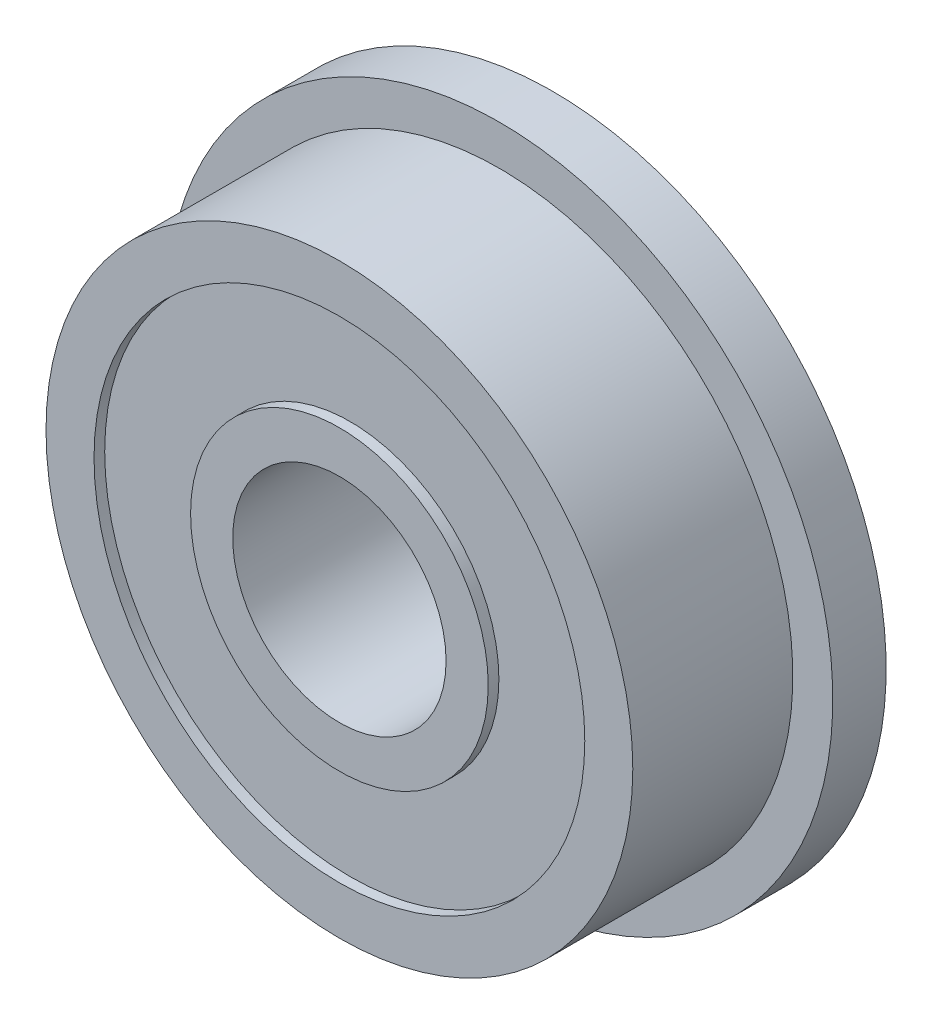
ISO-10303-21;
HEADER;
FILE_DESCRIPTION(('STEP AP214'),'2;1');
FILE_NAME('part.step','',(''),(''),'','','');
FILE_SCHEMA(('AUTOMOTIVE_DESIGN { 1 0 10303 214 1 1 1 1 }'));
ENDSEC;
DATA;
#1=APPLICATION_CONTEXT('core data for automotive mechanical design processes');
#2=APPLICATION_PROTOCOL_DEFINITION('international standard','automotive_design',2000,#1);
#3=PRODUCT_CONTEXT('',#1,'mechanical');
#4=PRODUCT('Part','Part','',(#3));
#5=PRODUCT_RELATED_PRODUCT_CATEGORY('part','',(#4));
#6=PRODUCT_DEFINITION_FORMATION('','',#4);
#7=PRODUCT_DEFINITION_CONTEXT('part definition',#1,'design');
#8=PRODUCT_DEFINITION('design','',#6,#7);
#9=PRODUCT_DEFINITION_SHAPE('','',#8);
#10=(LENGTH_UNIT() NAMED_UNIT(*) SI_UNIT(.MILLI.,.METRE.));
#11=(NAMED_UNIT(*) PLANE_ANGLE_UNIT() SI_UNIT($,.RADIAN.));
#12=(NAMED_UNIT(*) SI_UNIT($,.STERADIAN.) SOLID_ANGLE_UNIT());
#13=UNCERTAINTY_MEASURE_WITH_UNIT(LENGTH_MEASURE(1.E-05),#10,'distance_accuracy_value','');
#14=(GEOMETRIC_REPRESENTATION_CONTEXT(3) GLOBAL_UNCERTAINTY_ASSIGNED_CONTEXT((#13)) GLOBAL_UNIT_ASSIGNED_CONTEXT((#10,
#11,#12)) REPRESENTATION_CONTEXT('',''));
#15=CARTESIAN_POINT('',(0.,0.,0.));
#16=DIRECTION('',(0.,0.,1.));
#17=DIRECTION('',(1.,0.,0.));
#18=AXIS2_PLACEMENT_3D('',#15,#16,#17);
#19=CARTESIAN_POINT('',(0.,0.,-2.));
#20=DIRECTION('',(0.,0.,1.));
#21=DIRECTION('',(1.,0.,0.));
#22=AXIS2_PLACEMENT_3D('',#19,#20,#21);
#23=PLANE('',#22);
#24=CARTESIAN_POINT('',(0.,0.,-2.));
#25=DIRECTION('',(0.,0.,1.));
#26=DIRECTION('',(1.,0.,0.));
#27=AXIS2_PLACEMENT_3D('',#24,#25,#26);
#28=CIRCLE('',#27,2.);
#29=CARTESIAN_POINT('',(2.,0.,-2.));
#30=VERTEX_POINT('',#29);
#31=EDGE_CURVE('E50',#30,#30,#28,.T.);
#32=ORIENTED_EDGE('',*,*,#31,.T.);
#33=EDGE_LOOP('',(#32));
#34=FACE_BOUND('',#33,.T.);
#35=CARTESIAN_POINT('',(0.,0.,-2.));
#36=DIRECTION('',(0.,0.,1.));
#37=DIRECTION('',(1.,0.,0.));
#38=AXIS2_PLACEMENT_3D('',#35,#36,#37);
#39=CIRCLE('',#38,2.79);
#40=CARTESIAN_POINT('',(2.79,0.,-2.));
#41=VERTEX_POINT('',#40);
#42=EDGE_CURVE('E76',#41,#41,#39,.T.);
#43=ORIENTED_EDGE('',*,*,#42,.F.);
#44=EDGE_LOOP('',(#43));
#45=FACE_BOUND('',#44,.T.);
#46=ADVANCED_FACE('F31',(#34,#45),#23,.F.);
#47=CARTESIAN_POINT('',(0.,0.,2.));
#48=DIRECTION('',(0.,0.,1.));
#49=DIRECTION('',(1.,0.,0.));
#50=AXIS2_PLACEMENT_3D('',#47,#48,#49);
#51=PLANE('',#50);
#52=CARTESIAN_POINT('',(0.,0.,2.));
#53=DIRECTION('',(0.,0.,1.));
#54=DIRECTION('',(1.,0.,0.));
#55=AXIS2_PLACEMENT_3D('',#52,#53,#54);
#56=CIRCLE('',#55,2.);
#57=CARTESIAN_POINT('',(2.,0.,2.));
#58=VERTEX_POINT('',#57);
#59=EDGE_CURVE('E52',#58,#58,#56,.T.);
#60=ORIENTED_EDGE('',*,*,#59,.F.);
#61=EDGE_LOOP('',(#60));
#62=FACE_BOUND('',#61,.T.);
#63=CARTESIAN_POINT('',(0.,0.,2.));
#64=DIRECTION('',(0.,0.,1.));
#65=DIRECTION('',(1.,0.,0.));
#66=AXIS2_PLACEMENT_3D('',#63,#64,#65);
#67=CIRCLE('',#66,2.79);
#68=CARTESIAN_POINT('',(2.79,0.,2.));
#69=VERTEX_POINT('',#68);
#70=EDGE_CURVE('E64',#69,#69,#67,.T.);
#71=ORIENTED_EDGE('',*,*,#70,.T.);
#72=EDGE_LOOP('',(#71));
#73=FACE_BOUND('',#72,.T.);
#74=ADVANCED_FACE('F92',(#62,#73),#51,.T.);
#75=CARTESIAN_POINT('',(0.,0.,2.));
#76=DIRECTION('',(0.,0.,-1.));
#77=DIRECTION('',(-1.,0.,0.));
#78=AXIS2_PLACEMENT_3D('',#75,#76,#77);
#79=CYLINDRICAL_SURFACE('',#78,5.5);
#80=CARTESIAN_POINT('',(0.,0.,2.));
#81=DIRECTION('',(0.,0.,1.));
#82=DIRECTION('',(1.,0.,0.));
#83=AXIS2_PLACEMENT_3D('',#80,#81,#82);
#84=CIRCLE('',#83,5.5);
#85=CARTESIAN_POINT('',(5.5,0.,2.));
#86=VERTEX_POINT('',#85);
#87=EDGE_CURVE('E38',#86,#86,#84,.T.);
#88=ORIENTED_EDGE('',*,*,#87,.F.);
#89=EDGE_LOOP('',(#88));
#90=FACE_BOUND('',#89,.T.);
#91=CARTESIAN_POINT('',(0.,0.,-1.));
#92=DIRECTION('',(0.,0.,-1.));
#93=DIRECTION('',(-1.,0.,0.));
#94=AXIS2_PLACEMENT_3D('',#91,#92,#93);
#95=CIRCLE('',#94,5.5);
#96=CARTESIAN_POINT('',(-5.5,0.,-1.));
#97=VERTEX_POINT('',#96);
#98=EDGE_CURVE('E10',#97,#97,#95,.T.);
#99=ORIENTED_EDGE('',*,*,#98,.F.);
#100=EDGE_LOOP('',(#99));
#101=FACE_BOUND('',#100,.T.);
#102=ADVANCED_FACE('F33',(#90,#101),#79,.T.);
#103=CARTESIAN_POINT('',(0.,0.,2.));
#104=DIRECTION('',(0.,0.,1.));
#105=DIRECTION('',(1.,0.,0.));
#106=AXIS2_PLACEMENT_3D('',#103,#104,#105);
#107=CIRCLE('',#106,4.6);
#108=CARTESIAN_POINT('',(4.6,0.,2.));
#109=VERTEX_POINT('',#108);
#110=EDGE_CURVE('E58',#109,#109,#107,.T.);
#111=ORIENTED_EDGE('',*,*,#110,.F.);
#112=EDGE_LOOP('',(#111));
#113=FACE_BOUND('',#112,.T.);
#114=ORIENTED_EDGE('',*,*,#87,.T.);
#115=EDGE_LOOP('',(#114));
#116=FACE_BOUND('',#115,.T.);
#117=ADVANCED_FACE('F100',(#113,#116),#51,.T.);
#118=CARTESIAN_POINT('',(0.,0.,-1.));
#119=DIRECTION('',(0.,0.,-1.));
#120=DIRECTION('',(-1.,0.,0.));
#121=AXIS2_PLACEMENT_3D('',#118,#119,#120);
#122=CYLINDRICAL_SURFACE('',#121,6.25);
#123=CARTESIAN_POINT('',(0.,0.,-1.));
#124=DIRECTION('',(0.,0.,-1.));
#125=DIRECTION('',(-1.,0.,0.));
#126=AXIS2_PLACEMENT_3D('',#123,#124,#125);
#127=CIRCLE('',#126,6.25);
#128=CARTESIAN_POINT('',(-6.25,0.,-1.));
#129=VERTEX_POINT('',#128);
#130=EDGE_CURVE('E42',#129,#129,#127,.T.);
#131=ORIENTED_EDGE('',*,*,#130,.T.);
#132=EDGE_LOOP('',(#131));
#133=FACE_BOUND('',#132,.T.);
#134=CARTESIAN_POINT('',(0.,0.,-2.));
#135=DIRECTION('',(0.,0.,-1.));
#136=DIRECTION('',(-1.,0.,0.));
#137=AXIS2_PLACEMENT_3D('',#134,#135,#136);
#138=CIRCLE('',#137,6.25);
#139=CARTESIAN_POINT('',(-6.25,0.,-2.));
#140=VERTEX_POINT('',#139);
#141=EDGE_CURVE('E46',#140,#140,#138,.T.);
#142=ORIENTED_EDGE('',*,*,#141,.F.);
#143=EDGE_LOOP('',(#142));
#144=FACE_BOUND('',#143,.T.);
#145=ADVANCED_FACE('F112',(#133,#144),#122,.T.);
#146=CARTESIAN_POINT('',(0.,0.,-1.));
#147=DIRECTION('',(0.,0.,-1.));
#148=DIRECTION('',(-1.,0.,0.));
#149=AXIS2_PLACEMENT_3D('',#146,#147,#148);
#150=PLANE('',#149);
#151=ORIENTED_EDGE('',*,*,#98,.T.);
#152=EDGE_LOOP('',(#151));
#153=FACE_BOUND('',#152,.T.);
#154=ORIENTED_EDGE('',*,*,#130,.F.);
#155=EDGE_LOOP('',(#154));
#156=FACE_BOUND('',#155,.T.);
#157=ADVANCED_FACE('F103',(#153,#156),#150,.F.);
#158=CARTESIAN_POINT('',(0.,0.,-2.));
#159=DIRECTION('',(0.,0.,1.));
#160=DIRECTION('',(1.,0.,0.));
#161=AXIS2_PLACEMENT_3D('',#158,#159,#160);
#162=CIRCLE('',#161,4.6);
#163=CARTESIAN_POINT('',(4.6,0.,-2.));
#164=VERTEX_POINT('',#163);
#165=EDGE_CURVE('E70',#164,#164,#162,.T.);
#166=ORIENTED_EDGE('',*,*,#165,.T.);
#167=EDGE_LOOP('',(#166));
#168=FACE_BOUND('',#167,.T.);
#169=ORIENTED_EDGE('',*,*,#141,.T.);
#170=EDGE_LOOP('',(#169));
#171=FACE_BOUND('',#170,.T.);
#172=ADVANCED_FACE('F94',(#168,#171),#23,.F.);
#173=CARTESIAN_POINT('',(0.,0.,-2.));
#174=DIRECTION('',(0.,0.,1.));
#175=DIRECTION('',(1.,0.,0.));
#176=AXIS2_PLACEMENT_3D('',#173,#174,#175);
#177=CYLINDRICAL_SURFACE('',#176,2.);
#178=ORIENTED_EDGE('',*,*,#31,.F.);
#179=EDGE_LOOP('',(#178));
#180=FACE_BOUND('',#179,.T.);
#181=ORIENTED_EDGE('',*,*,#59,.T.);
#182=EDGE_LOOP('',(#181));
#183=FACE_BOUND('',#182,.T.);
#184=ADVANCED_FACE('F102',(#180,#183),#177,.F.);
#185=CARTESIAN_POINT('',(0.,0.,1.8));
#186=DIRECTION('',(0.,0.,1.));
#187=DIRECTION('',(1.,0.,0.));
#188=AXIS2_PLACEMENT_3D('',#185,#186,#187);
#189=CYLINDRICAL_SURFACE('',#188,4.6);
#190=CARTESIAN_POINT('',(0.,0.,1.8));
#191=DIRECTION('',(0.,0.,1.));
#192=DIRECTION('',(1.,0.,0.));
#193=AXIS2_PLACEMENT_3D('',#190,#191,#192);
#194=CIRCLE('',#193,4.6);
#195=CARTESIAN_POINT('',(4.6,0.,1.8));
#196=VERTEX_POINT('',#195);
#197=EDGE_CURVE('E55',#196,#196,#194,.T.);
#198=ORIENTED_EDGE('',*,*,#197,.F.);
#199=EDGE_LOOP('',(#198));
#200=FACE_BOUND('',#199,.T.);
#201=ORIENTED_EDGE('',*,*,#110,.T.);
#202=EDGE_LOOP('',(#201));
#203=FACE_BOUND('',#202,.T.);
#204=ADVANCED_FACE('F109',(#200,#203),#189,.F.);
#205=CARTESIAN_POINT('',(0.,0.,1.8));
#206=DIRECTION('',(0.,0.,1.));
#207=DIRECTION('',(1.,0.,0.));
#208=AXIS2_PLACEMENT_3D('',#205,#206,#207);
#209=PLANE('',#208);
#210=CARTESIAN_POINT('',(0.,0.,1.8));
#211=DIRECTION('',(0.,0.,1.));
#212=DIRECTION('',(1.,0.,0.));
#213=AXIS2_PLACEMENT_3D('',#210,#211,#212);
#214=CIRCLE('',#213,2.79);
#215=CARTESIAN_POINT('',(2.79,0.,1.8));
#216=VERTEX_POINT('',#215);
#217=EDGE_CURVE('E61',#216,#216,#214,.T.);
#218=ORIENTED_EDGE('',*,*,#217,.F.);
#219=EDGE_LOOP('',(#218));
#220=FACE_BOUND('',#219,.T.);
#221=ORIENTED_EDGE('',*,*,#197,.T.);
#222=EDGE_LOOP('',(#221));
#223=FACE_BOUND('',#222,.T.);
#224=ADVANCED_FACE('F128',(#220,#223),#209,.T.);
#225=CARTESIAN_POINT('',(0.,0.,1.8));
#226=DIRECTION('',(0.,0.,1.));
#227=DIRECTION('',(1.,0.,0.));
#228=AXIS2_PLACEMENT_3D('',#225,#226,#227);
#229=CYLINDRICAL_SURFACE('',#228,2.79);
#230=ORIENTED_EDGE('',*,*,#217,.T.);
#231=EDGE_LOOP('',(#230));
#232=FACE_BOUND('',#231,.T.);
#233=ORIENTED_EDGE('',*,*,#70,.F.);
#234=EDGE_LOOP('',(#233));
#235=FACE_BOUND('',#234,.T.);
#236=ADVANCED_FACE('F132',(#232,#235),#229,.T.);
#237=CARTESIAN_POINT('',(0.,0.,-1.8));
#238=DIRECTION('',(0.,0.,-1.));
#239=DIRECTION('',(1.,0.,0.));
#240=AXIS2_PLACEMENT_3D('',#237,#238,#239);
#241=PLANE('',#240);
#242=CARTESIAN_POINT('',(0.,0.,-1.8));
#243=DIRECTION('',(0.,0.,1.));
#244=DIRECTION('',(1.,0.,0.));
#245=AXIS2_PLACEMENT_3D('',#242,#243,#244);
#246=CIRCLE('',#245,4.6);
#247=CARTESIAN_POINT('',(4.6,0.,-1.8));
#248=VERTEX_POINT('',#247);
#249=EDGE_CURVE('E67',#248,#248,#246,.T.);
#250=ORIENTED_EDGE('',*,*,#249,.F.);
#251=EDGE_LOOP('',(#250));
#252=FACE_BOUND('',#251,.T.);
#253=CARTESIAN_POINT('',(0.,0.,-1.8));
#254=DIRECTION('',(0.,0.,1.));
#255=DIRECTION('',(1.,0.,0.));
#256=AXIS2_PLACEMENT_3D('',#253,#254,#255);
#257=CIRCLE('',#256,2.79);
#258=CARTESIAN_POINT('',(2.79,0.,-1.8));
#259=VERTEX_POINT('',#258);
#260=EDGE_CURVE('E73',#259,#259,#257,.T.);
#261=ORIENTED_EDGE('',*,*,#260,.T.);
#262=EDGE_LOOP('',(#261));
#263=FACE_BOUND('',#262,.T.);
#264=ADVANCED_FACE('F82',(#252,#263),#241,.T.);
#265=CARTESIAN_POINT('',(0.,0.,-1.8));
#266=DIRECTION('',(0.,0.,-1.));
#267=DIRECTION('',(-1.,0.,0.));
#268=AXIS2_PLACEMENT_3D('',#265,#266,#267);
#269=CYLINDRICAL_SURFACE('',#268,4.6);
#270=ORIENTED_EDGE('',*,*,#249,.T.);
#271=EDGE_LOOP('',(#270));
#272=FACE_BOUND('',#271,.T.);
#273=ORIENTED_EDGE('',*,*,#165,.F.);
#274=EDGE_LOOP('',(#273));
#275=FACE_BOUND('',#274,.T.);
#276=ADVANCED_FACE('F87',(#272,#275),#269,.F.);
#277=CARTESIAN_POINT('',(0.,0.,-1.8));
#278=DIRECTION('',(0.,0.,-1.));
#279=DIRECTION('',(-1.,0.,0.));
#280=AXIS2_PLACEMENT_3D('',#277,#278,#279);
#281=CYLINDRICAL_SURFACE('',#280,2.79);
#282=ORIENTED_EDGE('',*,*,#260,.F.);
#283=EDGE_LOOP('',(#282));
#284=FACE_BOUND('',#283,.T.);
#285=ORIENTED_EDGE('',*,*,#42,.T.);
#286=EDGE_LOOP('',(#285));
#287=FACE_BOUND('',#286,.T.);
#288=ADVANCED_FACE('F84',(#284,#287),#281,.T.);
#289=CLOSED_SHELL('',(#46,#74,#102,#117,#145,#157,#172,#184,#204,#224,#236,#264,#276,#288));
#290=MANIFOLD_SOLID_BREP('B2',#289);
#291=ADVANCED_BREP_SHAPE_REPRESENTATION('',(#18,#290),#14);
#292=SHAPE_DEFINITION_REPRESENTATION(#9,#291);
ENDSEC;
END-ISO-10303-21;
